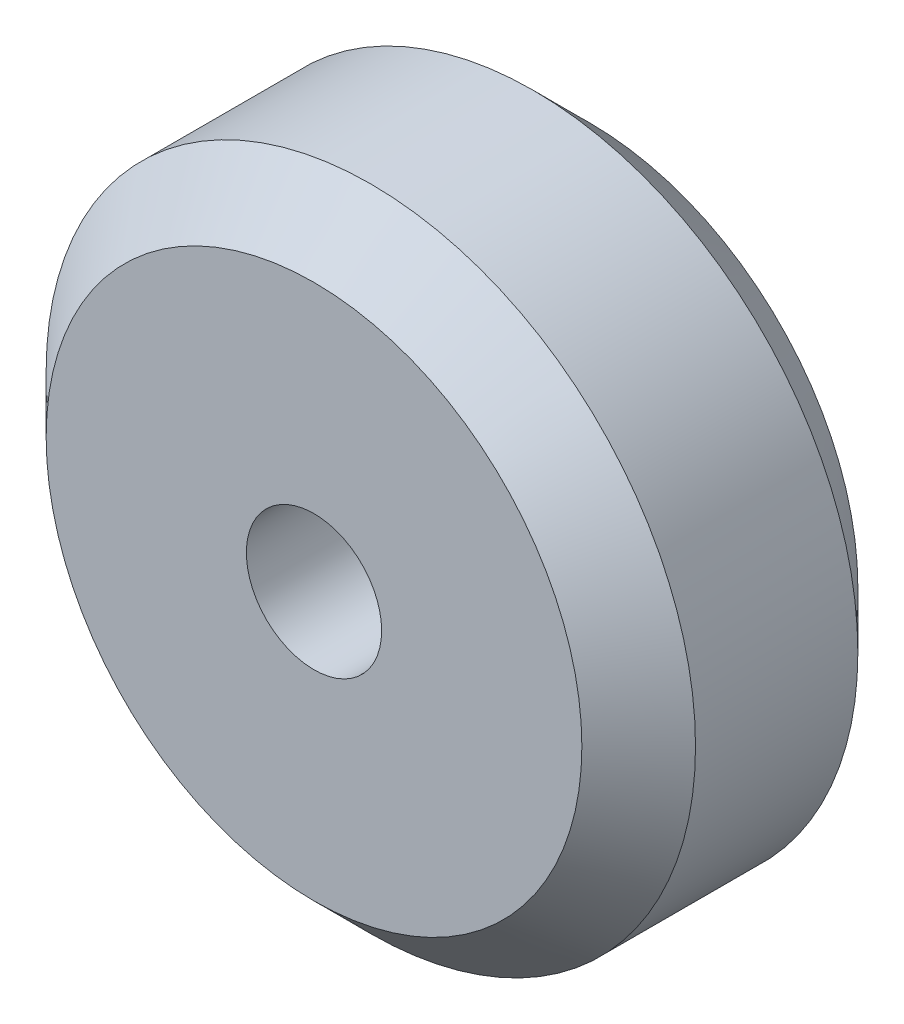
ISO-10303-21;
HEADER;
FILE_DESCRIPTION(('STEP AP214'),'2;1');
FILE_NAME('part.step','',(''),(''),'','','');
FILE_SCHEMA(('AUTOMOTIVE_DESIGN { 1 0 10303 214 1 1 1 1 }'));
ENDSEC;
DATA;
#1=APPLICATION_CONTEXT('core data for automotive mechanical design processes');
#2=APPLICATION_PROTOCOL_DEFINITION('international standard','automotive_design',2000,#1);
#3=PRODUCT_CONTEXT('',#1,'mechanical');
#4=PRODUCT('Part','Part','',(#3));
#5=PRODUCT_RELATED_PRODUCT_CATEGORY('part','',(#4));
#6=PRODUCT_DEFINITION_FORMATION('','',#4);
#7=PRODUCT_DEFINITION_CONTEXT('part definition',#1,'design');
#8=PRODUCT_DEFINITION('design','',#6,#7);
#9=PRODUCT_DEFINITION_SHAPE('','',#8);
#10=(LENGTH_UNIT() NAMED_UNIT(*) SI_UNIT(.MILLI.,.METRE.));
#11=(NAMED_UNIT(*) PLANE_ANGLE_UNIT() SI_UNIT($,.RADIAN.));
#12=(NAMED_UNIT(*) SI_UNIT($,.STERADIAN.) SOLID_ANGLE_UNIT());
#13=UNCERTAINTY_MEASURE_WITH_UNIT(LENGTH_MEASURE(1.E-05),#10,'distance_accuracy_value','');
#14=(GEOMETRIC_REPRESENTATION_CONTEXT(3) GLOBAL_UNCERTAINTY_ASSIGNED_CONTEXT((#13)) GLOBAL_UNIT_ASSIGNED_CONTEXT((#10,
#11,#12)) REPRESENTATION_CONTEXT('',''));
#15=CARTESIAN_POINT('',(0.,0.,0.));
#16=DIRECTION('',(0.,0.,1.));
#17=DIRECTION('',(1.,0.,0.));
#18=AXIS2_PLACEMENT_3D('',#15,#16,#17);
#19=CARTESIAN_POINT('',(0.,0.,10.2));
#20=DIRECTION('',(0.,0.,-1.));
#21=DIRECTION('',(-1.,0.,0.));
#22=AXIS2_PLACEMENT_3D('',#19,#20,#21);
#23=CYLINDRICAL_SURFACE('',#22,12.);
#24=CARTESIAN_POINT('',(0.,0.,2.09999999999999));
#25=DIRECTION('',(0.,0.,1.));
#26=DIRECTION('',(1.,0.,0.));
#27=AXIS2_PLACEMENT_3D('',#24,#25,#26);
#28=CIRCLE('',#27,12.);
#29=CARTESIAN_POINT('',(12.,0.,2.09999999999999));
#30=VERTEX_POINT('',#29);
#31=EDGE_CURVE('E38',#30,#30,#28,.T.);
#32=ORIENTED_EDGE('',*,*,#31,.T.);
#33=EDGE_LOOP('',(#32));
#34=FACE_BOUND('',#33,.T.);
#35=CARTESIAN_POINT('',(0.,0.,8.09999999999999));
#36=DIRECTION('',(0.,0.,1.));
#37=DIRECTION('',(1.,0.,0.));
#38=AXIS2_PLACEMENT_3D('',#35,#36,#37);
#39=CIRCLE('',#38,12.);
#40=CARTESIAN_POINT('',(-12.,0.,8.09999999999999));
#41=VERTEX_POINT('',#40);
#42=EDGE_CURVE('E42',#41,#41,#39,.F.);
#43=ORIENTED_EDGE('',*,*,#42,.T.);
#44=EDGE_LOOP('',(#43));
#45=FACE_BOUND('',#44,.T.);
#46=ADVANCED_FACE('F31',(#34,#45),#23,.T.);
#47=CARTESIAN_POINT('',(0.,0.,10.2));
#48=DIRECTION('',(0.,0.,1.));
#49=DIRECTION('',(1.,0.,0.));
#50=AXIS2_PLACEMENT_3D('',#47,#48,#49);
#51=PLANE('',#50);
#52=CARTESIAN_POINT('',(0.,0.,10.2));
#53=DIRECTION('',(0.,0.,1.));
#54=DIRECTION('',(1.,0.,0.));
#55=AXIS2_PLACEMENT_3D('',#52,#53,#54);
#56=CIRCLE('',#55,9.9);
#57=CARTESIAN_POINT('',(-9.9,0.,10.2));
#58=VERTEX_POINT('',#57);
#59=EDGE_CURVE('E46',#58,#58,#56,.T.);
#60=ORIENTED_EDGE('',*,*,#59,.T.);
#61=EDGE_LOOP('',(#60));
#62=FACE_BOUND('',#61,.T.);
#63=CARTESIAN_POINT('',(0.,0.,10.2));
#64=DIRECTION('',(0.,0.,1.));
#65=DIRECTION('',(1.,0.,0.));
#66=AXIS2_PLACEMENT_3D('',#63,#64,#65);
#67=CIRCLE('',#66,2.5);
#68=CARTESIAN_POINT('',(2.5,0.,10.2));
#69=VERTEX_POINT('',#68);
#70=EDGE_CURVE('E52',#69,#69,#67,.T.);
#71=ORIENTED_EDGE('',*,*,#70,.F.);
#72=EDGE_LOOP('',(#71));
#73=FACE_BOUND('',#72,.T.);
#74=ADVANCED_FACE('F67',(#62,#73),#51,.T.);
#75=CARTESIAN_POINT('',(0.,0.,0.));
#76=DIRECTION('',(0.,0.,1.));
#77=DIRECTION('',(1.,0.,0.));
#78=AXIS2_PLACEMENT_3D('',#75,#76,#77);
#79=PLANE('',#78);
#80=CARTESIAN_POINT('',(0.,0.,0.));
#81=DIRECTION('',(0.,0.,1.));
#82=DIRECTION('',(1.,0.,0.));
#83=AXIS2_PLACEMENT_3D('',#80,#81,#82);
#84=CIRCLE('',#83,9.9);
#85=CARTESIAN_POINT('',(9.9,0.,0.));
#86=VERTEX_POINT('',#85);
#87=EDGE_CURVE('E10',#86,#86,#84,.F.);
#88=ORIENTED_EDGE('',*,*,#87,.T.);
#89=EDGE_LOOP('',(#88));
#90=FACE_BOUND('',#89,.T.);
#91=CARTESIAN_POINT('',(0.,0.,0.));
#92=DIRECTION('',(0.,0.,1.));
#93=DIRECTION('',(1.,0.,0.));
#94=AXIS2_PLACEMENT_3D('',#91,#92,#93);
#95=CIRCLE('',#94,2.5);
#96=CARTESIAN_POINT('',(2.5,0.,0.));
#97=VERTEX_POINT('',#96);
#98=EDGE_CURVE('E51',#97,#97,#95,.T.);
#99=ORIENTED_EDGE('',*,*,#98,.T.);
#100=EDGE_LOOP('',(#99));
#101=FACE_BOUND('',#100,.T.);
#102=ADVANCED_FACE('F58',(#90,#101),#79,.F.);
#103=CARTESIAN_POINT('',(0.,0.,0.));
#104=DIRECTION('',(0.,0.,1.));
#105=DIRECTION('',(1.,0.,0.));
#106=AXIS2_PLACEMENT_3D('',#103,#104,#105);
#107=CYLINDRICAL_SURFACE('',#106,2.5);
#108=ORIENTED_EDGE('',*,*,#98,.F.);
#109=EDGE_LOOP('',(#108));
#110=FACE_BOUND('',#109,.T.);
#111=ORIENTED_EDGE('',*,*,#70,.T.);
#112=EDGE_LOOP('',(#111));
#113=FACE_BOUND('',#112,.T.);
#114=ADVANCED_FACE('F60',(#110,#113),#107,.F.);
#115=CARTESIAN_POINT('',(0.,0.,10.2));
#116=DIRECTION('',(0.,0.,-1.));
#117=DIRECTION('',(-1.,0.,0.));
#118=AXIS2_PLACEMENT_3D('',#115,#116,#117);
#119=CONICAL_SURFACE('',#118,9.9,0.785398163397446);
#120=CARTESIAN_POINT('',(-12.,0.,8.09999999999999));
#121=CARTESIAN_POINT('',(-11.978125,0.,8.12187499999999));
#122=CARTESIAN_POINT('',(-11.95625,0.,8.14374999999999));
#123=CARTESIAN_POINT('',(-11.9125,0.,8.18749999999999));
#124=CARTESIAN_POINT('',(-11.890625,0.,8.20937499999999));
#125=CARTESIAN_POINT('',(-11.846875,0.,8.25312499999999));
#126=CARTESIAN_POINT('',(-11.825,0.,8.27499999999999));
#127=CARTESIAN_POINT('',(-11.78125,0.,8.31874999999999));
#128=CARTESIAN_POINT('',(-11.759375,0.,8.34062499999999));
#129=CARTESIAN_POINT('',(-11.715625,0.,8.38437499999999));
#130=CARTESIAN_POINT('',(-11.69375,0.,8.40624999999999));
#131=CARTESIAN_POINT('',(-11.65,0.,8.44999999999999));
#132=CARTESIAN_POINT('',(-11.628125,0.,8.47187499999999));
#133=CARTESIAN_POINT('',(-11.584375,0.,8.51562499999999));
#134=CARTESIAN_POINT('',(-11.5625,0.,8.53749999999999));
#135=CARTESIAN_POINT('',(-11.51875,0.,8.58124999999999));
#136=CARTESIAN_POINT('',(-11.496875,0.,8.60312499999999));
#137=CARTESIAN_POINT('',(-11.453125,0.,8.64687499999999));
#138=CARTESIAN_POINT('',(-11.43125,0.,8.66874999999999));
#139=CARTESIAN_POINT('',(-11.3875,0.,8.71249999999999));
#140=CARTESIAN_POINT('',(-11.365625,0.,8.73437499999999));
#141=CARTESIAN_POINT('',(-11.321875,0.,8.77812499999999));
#142=CARTESIAN_POINT('',(-11.3,0.,8.79999999999999));
#143=CARTESIAN_POINT('',(-11.25625,0.,8.84374999999999));
#144=CARTESIAN_POINT('',(-11.234375,0.,8.86562499999999));
#145=CARTESIAN_POINT('',(-11.190625,0.,8.90937499999999));
#146=CARTESIAN_POINT('',(-11.16875,0.,8.93124999999999));
#147=CARTESIAN_POINT('',(-11.125,0.,8.97499999999999));
#148=CARTESIAN_POINT('',(-11.103125,0.,8.99687499999999));
#149=CARTESIAN_POINT('',(-11.059375,0.,9.04062499999999));
#150=CARTESIAN_POINT('',(-11.0375,0.,9.06249999999999));
#151=CARTESIAN_POINT('',(-10.99375,0.,9.10624999999999));
#152=CARTESIAN_POINT('',(-10.971875,0.,9.12812499999999));
#153=CARTESIAN_POINT('',(-10.928125,0.,9.17187499999999));
#154=CARTESIAN_POINT('',(-10.90625,0.,9.19374999999999));
#155=CARTESIAN_POINT('',(-10.8625,0.,9.23749999999999));
#156=CARTESIAN_POINT('',(-10.840625,0.,9.25937499999999));
#157=CARTESIAN_POINT('',(-10.796875,0.,9.30312499999999));
#158=CARTESIAN_POINT('',(-10.775,0.,9.32499999999999));
#159=CARTESIAN_POINT('',(-10.73125,0.,9.36874999999999));
#160=CARTESIAN_POINT('',(-10.709375,0.,9.39062499999999));
#161=CARTESIAN_POINT('',(-10.665625,0.,9.434375));
#162=CARTESIAN_POINT('',(-10.64375,0.,9.45624999999999));
#163=CARTESIAN_POINT('',(-10.6,0.,9.49999999999999));
#164=CARTESIAN_POINT('',(-10.578125,0.,9.521875));
#165=CARTESIAN_POINT('',(-10.534375,0.,9.56562499999999));
#166=CARTESIAN_POINT('',(-10.5125,0.,9.5875));
#167=CARTESIAN_POINT('',(-10.46875,0.,9.63125));
#168=CARTESIAN_POINT('',(-10.446875,0.,9.653125));
#169=CARTESIAN_POINT('',(-10.403125,0.,9.696875));
#170=CARTESIAN_POINT('',(-10.38125,0.,9.71875));
#171=CARTESIAN_POINT('',(-10.3375,0.,9.7625));
#172=CARTESIAN_POINT('',(-10.315625,0.,9.784375));
#173=CARTESIAN_POINT('',(-10.271875,0.,9.828125));
#174=CARTESIAN_POINT('',(-10.25,0.,9.85));
#175=CARTESIAN_POINT('',(-10.20625,0.,9.89375));
#176=CARTESIAN_POINT('',(-10.184375,0.,9.915625));
#177=CARTESIAN_POINT('',(-10.140625,0.,9.959375));
#178=CARTESIAN_POINT('',(-10.11875,0.,9.98125));
#179=CARTESIAN_POINT('',(-10.075,0.,10.025));
#180=CARTESIAN_POINT('',(-10.053125,0.,10.046875));
#181=CARTESIAN_POINT('',(-10.009375,0.,10.090625));
#182=CARTESIAN_POINT('',(-9.9875,0.,10.1125));
#183=CARTESIAN_POINT('',(-9.94375,0.,10.15625));
#184=CARTESIAN_POINT('',(-9.921875,0.,10.178125));
#185=CARTESIAN_POINT('',(-9.9,0.,10.2));
#186=B_SPLINE_CURVE_WITH_KNOTS('',3,(#120,#121,#122,#123,#124,#125,#126,#127,#128,#129,#130,
#131,#132,#133,#134,#135,#136,#137,#138,#139,#140,#141,#142,#143,#144,#145,#146,#147,#148,#149,
#150,#151,#152,#153,#154,#155,#156,#157,#158,#159,#160,#161,#162,#163,#164,#165,#166,#167,#168,
#169,#170,#171,#172,#173,#174,#175,#176,#177,#178,#179,#180,#181,#182,#183,#184,#185),
.UNSPECIFIED.,.F.,.F.,(4,2,2,2,2,2,2,2,2,2,2,2,2,2,2,2,2,2,2,2,2,2,2,2,2,2,2,2,2,2,2,2,4),(0.,
0.0928077650307352,0.185615530061469,0.278423295092203,0.371231060122939,0.464038825153673,
0.556846590184407,0.649654355215142,0.742462120245876,0.835269885276612,0.928077650307347,
1.02088541533808,1.11369318036881,1.20650094539955,1.29930871043028,1.39211647546102,
1.48492424049175,1.57773200552249,1.67053977055322,1.76334753558396,1.85615530061469,
1.94896306564543,2.04177083067616,2.1345785957069,2.22738636073763,2.32019412576836,
2.4130018907991,2.50580965582984,2.59861742086057,2.6914251858913,2.78423295092204,
2.87704071595277,2.96984848098351),.UNSPECIFIED.);
#187=EDGE_CURVE('BSEAM63',#41,#58,#186,.T.);
#188=ORIENTED_EDGE('',*,*,#42,.F.);
#189=ORIENTED_EDGE('',*,*,#59,.F.);
#190=ORIENTED_EDGE('',*,*,#187,.T.);
#191=ORIENTED_EDGE('',*,*,#187,.F.);
#192=EDGE_LOOP('',(#188,#190,#189,#191));
#193=FACE_BOUND('',#192,.T.);
#194=ADVANCED_FACE('F63',(#193),#119,.T.);
#195=CARTESIAN_POINT('',(0.,0.,2.09999999999999));
#196=DIRECTION('',(0.,0.,1.));
#197=DIRECTION('',(1.,0.,0.));
#198=AXIS2_PLACEMENT_3D('',#195,#196,#197);
#199=CONICAL_SURFACE('',#198,12.,0.78539816339745);
#200=ORIENTED_EDGE('',*,*,#87,.F.);
#201=EDGE_LOOP('',(#200));
#202=FACE_BOUND('',#201,.T.);
#203=ORIENTED_EDGE('',*,*,#31,.F.);
#204=EDGE_LOOP('',(#203));
#205=FACE_BOUND('',#204,.T.);
#206=ADVANCED_FACE('F33',(#202,#205),#199,.T.);
#207=CLOSED_SHELL('',(#46,#74,#102,#114,#194,#206));
#208=MANIFOLD_SOLID_BREP('B2',#207);
#209=ADVANCED_BREP_SHAPE_REPRESENTATION('',(#18,#208),#14);
#210=SHAPE_DEFINITION_REPRESENTATION(#9,#209);
ENDSEC;
END-ISO-10303-21;
